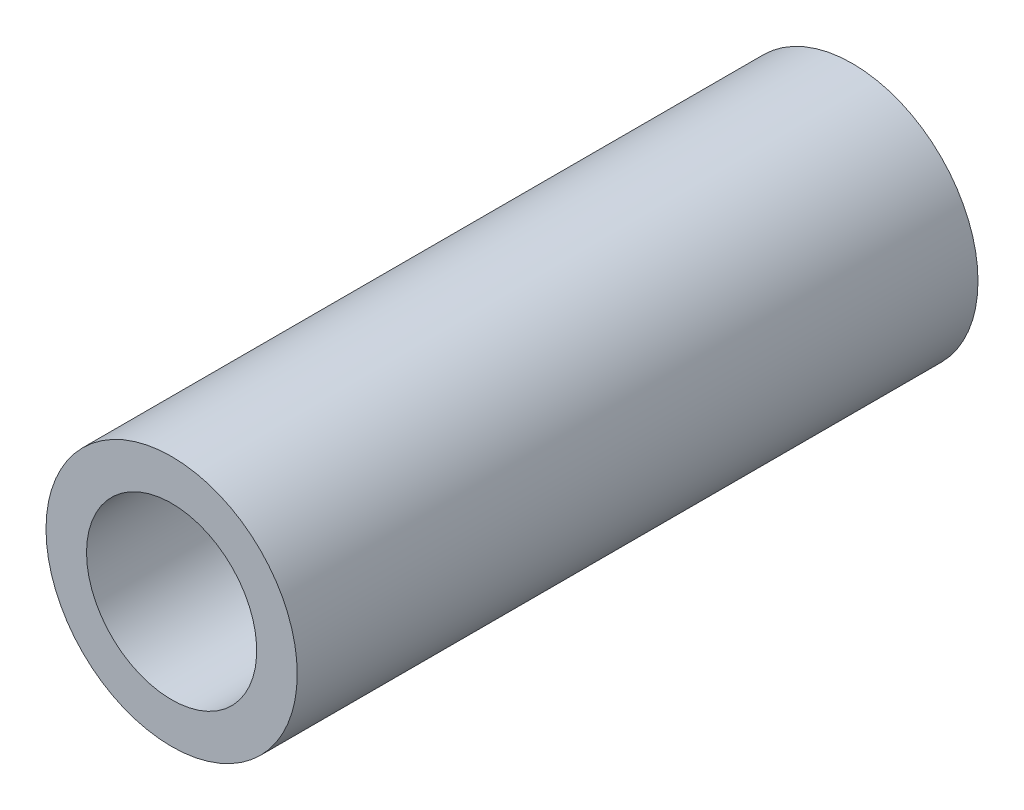
ISO-10303-21;
HEADER;
FILE_DESCRIPTION(('STEP AP214'),'2;1');
FILE_NAME('part.step','',(''),(''),'','','');
FILE_SCHEMA(('AUTOMOTIVE_DESIGN { 1 0 10303 214 1 1 1 1 }'));
ENDSEC;
DATA;
#1=APPLICATION_CONTEXT('core data for automotive mechanical design processes');
#2=APPLICATION_PROTOCOL_DEFINITION('international standard','automotive_design',2000,#1);
#3=PRODUCT_CONTEXT('',#1,'mechanical');
#4=PRODUCT('Part','Part','',(#3));
#5=PRODUCT_RELATED_PRODUCT_CATEGORY('part','',(#4));
#6=PRODUCT_DEFINITION_FORMATION('','',#4);
#7=PRODUCT_DEFINITION_CONTEXT('part definition',#1,'design');
#8=PRODUCT_DEFINITION('design','',#6,#7);
#9=PRODUCT_DEFINITION_SHAPE('','',#8);
#10=(LENGTH_UNIT() NAMED_UNIT(*) SI_UNIT(.MILLI.,.METRE.));
#11=(NAMED_UNIT(*) PLANE_ANGLE_UNIT() SI_UNIT($,.RADIAN.));
#12=(NAMED_UNIT(*) SI_UNIT($,.STERADIAN.) SOLID_ANGLE_UNIT());
#13=UNCERTAINTY_MEASURE_WITH_UNIT(LENGTH_MEASURE(1.E-05),#10,'distance_accuracy_value','');
#14=(GEOMETRIC_REPRESENTATION_CONTEXT(3) GLOBAL_UNCERTAINTY_ASSIGNED_CONTEXT((#13)) GLOBAL_UNIT_ASSIGNED_CONTEXT((#10,
#11,#12)) REPRESENTATION_CONTEXT('',''));
#15=CARTESIAN_POINT('',(0.,0.,0.));
#16=DIRECTION('',(0.,0.,1.));
#17=DIRECTION('',(1.,0.,0.));
#18=AXIS2_PLACEMENT_3D('',#15,#16,#17);
#19=CARTESIAN_POINT('',(0.,0.,84.));
#20=DIRECTION('',(0.,0.,1.));
#21=DIRECTION('',(1.,0.,0.));
#22=AXIS2_PLACEMENT_3D('',#19,#20,#21);
#23=PLANE('',#22);
#24=CARTESIAN_POINT('',(0.,0.,84.));
#25=DIRECTION('',(0.,0.,1.));
#26=DIRECTION('',(1.,0.,0.));
#27=AXIS2_PLACEMENT_3D('',#24,#25,#26);
#28=CIRCLE('',#27,15.5);
#29=CARTESIAN_POINT('',(-15.5,0.,84.));
#30=VERTEX_POINT('',#29);
#31=EDGE_CURVE('E10',#30,#30,#28,.T.);
#32=ORIENTED_EDGE('',*,*,#31,.T.);
#33=EDGE_LOOP('',(#32));
#34=FACE_BOUND('',#33,.T.);
#35=CARTESIAN_POINT('',(0.,0.,84.));
#36=DIRECTION('',(0.,0.,1.));
#37=DIRECTION('',(1.,0.,0.));
#38=AXIS2_PLACEMENT_3D('',#35,#36,#37);
#39=CIRCLE('',#38,10.5);
#40=CARTESIAN_POINT('',(-10.5,0.,84.));
#41=VERTEX_POINT('',#40);
#42=EDGE_CURVE('E50',#41,#41,#39,.T.);
#43=ORIENTED_EDGE('',*,*,#42,.F.);
#44=EDGE_LOOP('',(#43));
#45=FACE_BOUND('',#44,.T.);
#46=ADVANCED_FACE('F37',(#34,#45),#23,.T.);
#47=CARTESIAN_POINT('',(0.,0.,0.));
#48=DIRECTION('',(0.,0.,1.));
#49=DIRECTION('',(1.,0.,0.));
#50=AXIS2_PLACEMENT_3D('',#47,#48,#49);
#51=PLANE('',#50);
#52=CARTESIAN_POINT('',(0.,0.,0.));
#53=DIRECTION('',(0.,0.,1.));
#54=DIRECTION('',(1.,0.,0.));
#55=AXIS2_PLACEMENT_3D('',#52,#53,#54);
#56=CIRCLE('',#55,15.5);
#57=CARTESIAN_POINT('',(-15.5,0.,0.));
#58=VERTEX_POINT('',#57);
#59=EDGE_CURVE('E41',#58,#58,#56,.T.);
#60=ORIENTED_EDGE('',*,*,#59,.F.);
#61=EDGE_LOOP('',(#60));
#62=FACE_BOUND('',#61,.T.);
#63=CARTESIAN_POINT('',(0.,0.,0.));
#64=DIRECTION('',(0.,0.,1.));
#65=DIRECTION('',(1.,0.,0.));
#66=AXIS2_PLACEMENT_3D('',#63,#64,#65);
#67=CIRCLE('',#66,10.5);
#68=CARTESIAN_POINT('',(-10.5,0.,0.));
#69=VERTEX_POINT('',#68);
#70=EDGE_CURVE('E52',#69,#69,#67,.T.);
#71=ORIENTED_EDGE('',*,*,#70,.T.);
#72=EDGE_LOOP('',(#71));
#73=FACE_BOUND('',#72,.T.);
#74=ADVANCED_FACE('F64',(#62,#73),#51,.F.);
#75=CARTESIAN_POINT('',(0.,0.,84.));
#76=DIRECTION('',(0.,0.,-1.));
#77=DIRECTION('',(-1.,0.,0.));
#78=AXIS2_PLACEMENT_3D('',#75,#76,#77);
#79=CYLINDRICAL_SURFACE('',#78,15.5);
#80=CARTESIAN_POINT('',(-15.5,0.,84.));
#81=CARTESIAN_POINT('',(-15.5,0.,83.125));
#82=CARTESIAN_POINT('',(-15.5,0.,82.25));
#83=CARTESIAN_POINT('',(-15.5,0.,80.5));
#84=CARTESIAN_POINT('',(-15.5,0.,79.625));
#85=CARTESIAN_POINT('',(-15.5,0.,77.875));
#86=CARTESIAN_POINT('',(-15.5,0.,77.));
#87=CARTESIAN_POINT('',(-15.5,0.,75.25));
#88=CARTESIAN_POINT('',(-15.5,0.,74.375));
#89=CARTESIAN_POINT('',(-15.5,0.,72.625));
#90=CARTESIAN_POINT('',(-15.5,0.,71.75));
#91=CARTESIAN_POINT('',(-15.5,0.,70.));
#92=CARTESIAN_POINT('',(-15.5,0.,69.125));
#93=CARTESIAN_POINT('',(-15.5,0.,67.375));
#94=CARTESIAN_POINT('',(-15.5,0.,66.5));
#95=CARTESIAN_POINT('',(-15.5,0.,64.75));
#96=CARTESIAN_POINT('',(-15.5,0.,63.875));
#97=CARTESIAN_POINT('',(-15.5,0.,62.125));
#98=CARTESIAN_POINT('',(-15.5,0.,61.25));
#99=CARTESIAN_POINT('',(-15.5,0.,59.5));
#100=CARTESIAN_POINT('',(-15.5,0.,58.625));
#101=CARTESIAN_POINT('',(-15.5,0.,56.875));
#102=CARTESIAN_POINT('',(-15.5,0.,56.));
#103=CARTESIAN_POINT('',(-15.5,0.,54.25));
#104=CARTESIAN_POINT('',(-15.5,0.,53.375));
#105=CARTESIAN_POINT('',(-15.5,0.,51.625));
#106=CARTESIAN_POINT('',(-15.5,0.,50.75));
#107=CARTESIAN_POINT('',(-15.5,0.,49.));
#108=CARTESIAN_POINT('',(-15.5,0.,48.125));
#109=CARTESIAN_POINT('',(-15.5,0.,46.375));
#110=CARTESIAN_POINT('',(-15.5,0.,45.5));
#111=CARTESIAN_POINT('',(-15.5,0.,43.75));
#112=CARTESIAN_POINT('',(-15.5,0.,42.875));
#113=CARTESIAN_POINT('',(-15.5,0.,41.125));
#114=CARTESIAN_POINT('',(-15.5,0.,40.25));
#115=CARTESIAN_POINT('',(-15.5,0.,38.5));
#116=CARTESIAN_POINT('',(-15.5,0.,37.625));
#117=CARTESIAN_POINT('',(-15.5,0.,35.875));
#118=CARTESIAN_POINT('',(-15.5,0.,35.));
#119=CARTESIAN_POINT('',(-15.5,0.,33.25));
#120=CARTESIAN_POINT('',(-15.5,0.,32.375));
#121=CARTESIAN_POINT('',(-15.5,0.,30.625));
#122=CARTESIAN_POINT('',(-15.5,0.,29.75));
#123=CARTESIAN_POINT('',(-15.5,0.,28.));
#124=CARTESIAN_POINT('',(-15.5,0.,27.125));
#125=CARTESIAN_POINT('',(-15.5,0.,25.375));
#126=CARTESIAN_POINT('',(-15.5,0.,24.5));
#127=CARTESIAN_POINT('',(-15.5,0.,22.75));
#128=CARTESIAN_POINT('',(-15.5,0.,21.875));
#129=CARTESIAN_POINT('',(-15.5,0.,20.125));
#130=CARTESIAN_POINT('',(-15.5,0.,19.25));
#131=CARTESIAN_POINT('',(-15.5,0.,17.5));
#132=CARTESIAN_POINT('',(-15.5,0.,16.625));
#133=CARTESIAN_POINT('',(-15.5,0.,14.875));
#134=CARTESIAN_POINT('',(-15.5,0.,14.));
#135=CARTESIAN_POINT('',(-15.5,0.,12.25));
#136=CARTESIAN_POINT('',(-15.5,0.,11.375));
#137=CARTESIAN_POINT('',(-15.5,0.,9.62500000000001));
#138=CARTESIAN_POINT('',(-15.5,0.,8.75000000000001));
#139=CARTESIAN_POINT('',(-15.5,0.,7.00000000000001));
#140=CARTESIAN_POINT('',(-15.5,0.,6.12500000000001));
#141=CARTESIAN_POINT('',(-15.5,0.,4.375));
#142=CARTESIAN_POINT('',(-15.5,0.,3.5));
#143=CARTESIAN_POINT('',(-15.5,0.,1.75));
#144=CARTESIAN_POINT('',(-15.5,0.,0.875));
#145=CARTESIAN_POINT('',(-15.5,0.,0.));
#146=B_SPLINE_CURVE_WITH_KNOTS('',3,(#80,#81,#82,#83,#84,#85,#86,#87,#88,#89,#90,#91,#92,#93,
#94,#95,#96,#97,#98,#99,#100,#101,#102,#103,#104,#105,#106,#107,#108,#109,#110,#111,#112,#113,
#114,#115,#116,#117,#118,#119,#120,#121,#122,#123,#124,#125,#126,#127,#128,#129,#130,#131,#132,
#133,#134,#135,#136,#137,#138,#139,#140,#141,#142,#143,#144,#145),.UNSPECIFIED.,.F.,.F.,(4,2,2,
2,2,2,2,2,2,2,2,2,2,2,2,2,2,2,2,2,2,2,2,2,2,2,2,2,2,2,2,2,4),(0.,2.625,5.25,7.87500000000001,
10.5,13.125,15.75,18.375,21.,23.625,26.25,28.875,31.5,34.125,36.75,39.375,42.,44.625,47.25,
49.875,52.5,55.125,57.75,60.375,63.,65.625,68.25,70.875,73.5,76.125,78.75,81.375,84.),.UNSPECIFIED.);
#147=EDGE_CURVE('BSEAM39',#30,#58,#146,.T.);
#148=ORIENTED_EDGE('',*,*,#31,.F.);
#149=ORIENTED_EDGE('',*,*,#59,.T.);
#150=ORIENTED_EDGE('',*,*,#147,.T.);
#151=ORIENTED_EDGE('',*,*,#147,.F.);
#152=EDGE_LOOP('',(#148,#150,#149,#151));
#153=FACE_BOUND('',#152,.T.);
#154=ADVANCED_FACE('F39',(#153),#79,.T.);
#155=CARTESIAN_POINT('',(0.,0.,84.));
#156=DIRECTION('',(0.,0.,-1.));
#157=DIRECTION('',(-1.,0.,0.));
#158=AXIS2_PLACEMENT_3D('',#155,#156,#157);
#159=CYLINDRICAL_SURFACE('',#158,10.5);
#160=CARTESIAN_POINT('',(-10.5,0.,84.));
#161=CARTESIAN_POINT('',(-10.5,0.,83.125));
#162=CARTESIAN_POINT('',(-10.5,0.,82.25));
#163=CARTESIAN_POINT('',(-10.5,0.,80.5));
#164=CARTESIAN_POINT('',(-10.5,0.,79.625));
#165=CARTESIAN_POINT('',(-10.5,0.,77.875));
#166=CARTESIAN_POINT('',(-10.5,0.,77.));
#167=CARTESIAN_POINT('',(-10.5,0.,75.25));
#168=CARTESIAN_POINT('',(-10.5,0.,74.375));
#169=CARTESIAN_POINT('',(-10.5,0.,72.625));
#170=CARTESIAN_POINT('',(-10.5,0.,71.75));
#171=CARTESIAN_POINT('',(-10.5,0.,70.));
#172=CARTESIAN_POINT('',(-10.5,0.,69.125));
#173=CARTESIAN_POINT('',(-10.5,0.,67.375));
#174=CARTESIAN_POINT('',(-10.5,0.,66.5));
#175=CARTESIAN_POINT('',(-10.5,0.,64.75));
#176=CARTESIAN_POINT('',(-10.5,0.,63.875));
#177=CARTESIAN_POINT('',(-10.5,0.,62.125));
#178=CARTESIAN_POINT('',(-10.5,0.,61.25));
#179=CARTESIAN_POINT('',(-10.5,0.,59.5));
#180=CARTESIAN_POINT('',(-10.5,0.,58.625));
#181=CARTESIAN_POINT('',(-10.5,0.,56.875));
#182=CARTESIAN_POINT('',(-10.5,0.,56.));
#183=CARTESIAN_POINT('',(-10.5,0.,54.25));
#184=CARTESIAN_POINT('',(-10.5,0.,53.375));
#185=CARTESIAN_POINT('',(-10.5,0.,51.625));
#186=CARTESIAN_POINT('',(-10.5,0.,50.75));
#187=CARTESIAN_POINT('',(-10.5,0.,49.));
#188=CARTESIAN_POINT('',(-10.5,0.,48.125));
#189=CARTESIAN_POINT('',(-10.5,0.,46.375));
#190=CARTESIAN_POINT('',(-10.5,0.,45.5));
#191=CARTESIAN_POINT('',(-10.5,0.,43.75));
#192=CARTESIAN_POINT('',(-10.5,0.,42.875));
#193=CARTESIAN_POINT('',(-10.5,0.,41.125));
#194=CARTESIAN_POINT('',(-10.5,0.,40.25));
#195=CARTESIAN_POINT('',(-10.5,0.,38.5));
#196=CARTESIAN_POINT('',(-10.5,0.,37.625));
#197=CARTESIAN_POINT('',(-10.5,0.,35.875));
#198=CARTESIAN_POINT('',(-10.5,0.,35.));
#199=CARTESIAN_POINT('',(-10.5,0.,33.25));
#200=CARTESIAN_POINT('',(-10.5,0.,32.375));
#201=CARTESIAN_POINT('',(-10.5,0.,30.625));
#202=CARTESIAN_POINT('',(-10.5,0.,29.75));
#203=CARTESIAN_POINT('',(-10.5,0.,28.));
#204=CARTESIAN_POINT('',(-10.5,0.,27.125));
#205=CARTESIAN_POINT('',(-10.5,0.,25.375));
#206=CARTESIAN_POINT('',(-10.5,0.,24.5));
#207=CARTESIAN_POINT('',(-10.5,0.,22.75));
#208=CARTESIAN_POINT('',(-10.5,0.,21.875));
#209=CARTESIAN_POINT('',(-10.5,0.,20.125));
#210=CARTESIAN_POINT('',(-10.5,0.,19.25));
#211=CARTESIAN_POINT('',(-10.5,0.,17.5));
#212=CARTESIAN_POINT('',(-10.5,0.,16.625));
#213=CARTESIAN_POINT('',(-10.5,0.,14.875));
#214=CARTESIAN_POINT('',(-10.5,0.,14.));
#215=CARTESIAN_POINT('',(-10.5,0.,12.25));
#216=CARTESIAN_POINT('',(-10.5,0.,11.375));
#217=CARTESIAN_POINT('',(-10.5,0.,9.62500000000001));
#218=CARTESIAN_POINT('',(-10.5,0.,8.75000000000001));
#219=CARTESIAN_POINT('',(-10.5,0.,7.00000000000001));
#220=CARTESIAN_POINT('',(-10.5,0.,6.12500000000001));
#221=CARTESIAN_POINT('',(-10.5,0.,4.375));
#222=CARTESIAN_POINT('',(-10.5,0.,3.5));
#223=CARTESIAN_POINT('',(-10.5,0.,1.75));
#224=CARTESIAN_POINT('',(-10.5,0.,0.875));
#225=CARTESIAN_POINT('',(-10.5,0.,0.));
#226=B_SPLINE_CURVE_WITH_KNOTS('',3,(#160,#161,#162,#163,#164,#165,#166,#167,#168,#169,#170,
#171,#172,#173,#174,#175,#176,#177,#178,#179,#180,#181,#182,#183,#184,#185,#186,#187,#188,#189,
#190,#191,#192,#193,#194,#195,#196,#197,#198,#199,#200,#201,#202,#203,#204,#205,#206,#207,#208,
#209,#210,#211,#212,#213,#214,#215,#216,#217,#218,#219,#220,#221,#222,#223,#224,#225),
.UNSPECIFIED.,.F.,.F.,(4,2,2,2,2,2,2,2,2,2,2,2,2,2,2,2,2,2,2,2,2,2,2,2,2,2,2,2,2,2,2,2,4),(0.,
2.625,5.25,7.87500000000001,10.5,13.125,15.75,18.375,21.,23.625,26.25,28.875,31.5,34.125,36.75,
39.375,42.,44.625,47.25,49.875,52.5,55.125,57.75,60.375,63.,65.625,68.25,70.875,73.5,76.125,
78.75,81.375,84.),.UNSPECIFIED.);
#227=EDGE_CURVE('BSEAM60',#41,#69,#226,.T.);
#228=ORIENTED_EDGE('',*,*,#42,.T.);
#229=ORIENTED_EDGE('',*,*,#70,.F.);
#230=ORIENTED_EDGE('',*,*,#227,.T.);
#231=ORIENTED_EDGE('',*,*,#227,.F.);
#232=EDGE_LOOP('',(#228,#230,#229,#231));
#233=FACE_BOUND('',#232,.T.);
#234=ADVANCED_FACE('F60',(#233),#159,.F.);
#235=CLOSED_SHELL('',(#46,#74,#154,#234));
#236=MANIFOLD_SOLID_BREP('B2',#235);
#237=ADVANCED_BREP_SHAPE_REPRESENTATION('',(#18,#236),#14);
#238=SHAPE_DEFINITION_REPRESENTATION(#9,#237);
ENDSEC;
END-ISO-10303-21;
